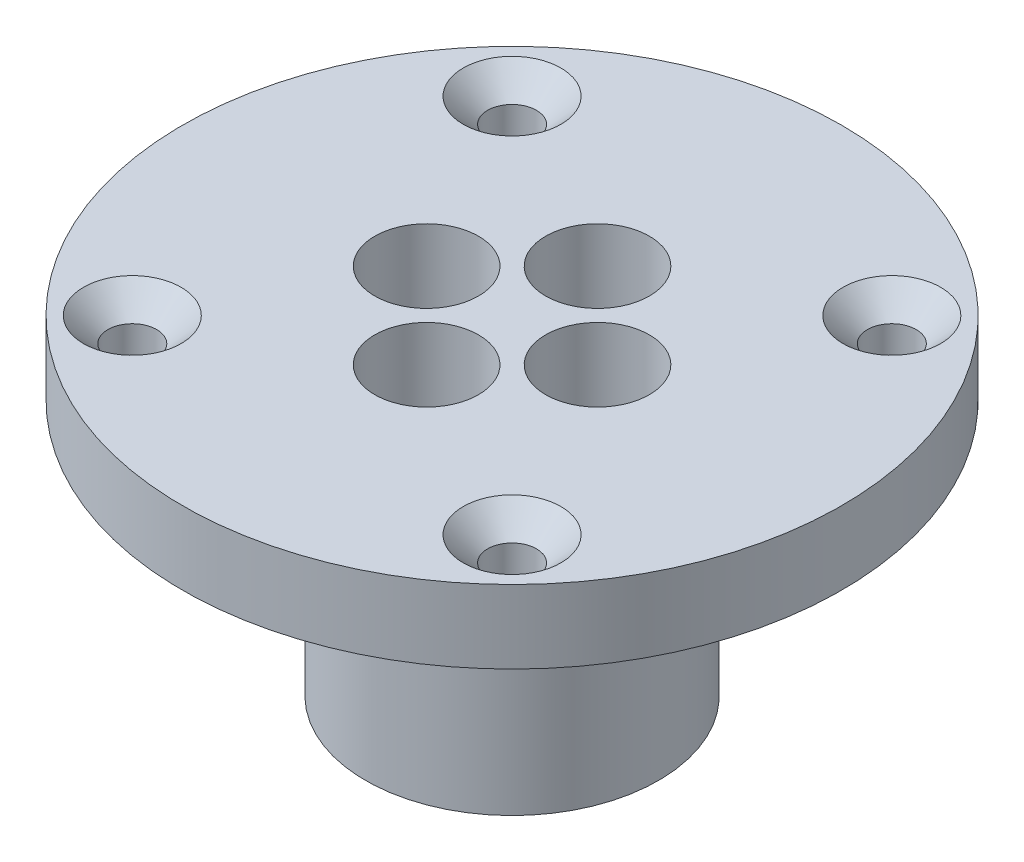
ISO-10303-21;
HEADER;
FILE_DESCRIPTION(('STEP AP214'),'2;1');
FILE_NAME('part.step','',(''),(''),'','','');
FILE_SCHEMA(('AUTOMOTIVE_DESIGN { 1 0 10303 214 1 1 1 1 }'));
ENDSEC;
DATA;
#1=APPLICATION_CONTEXT('core data for automotive mechanical design processes');
#2=APPLICATION_PROTOCOL_DEFINITION('international standard','automotive_design',2000,#1);
#3=PRODUCT_CONTEXT('',#1,'mechanical');
#4=PRODUCT('Part','Part','',(#3));
#5=PRODUCT_RELATED_PRODUCT_CATEGORY('part','',(#4));
#6=PRODUCT_DEFINITION_FORMATION('','',#4);
#7=PRODUCT_DEFINITION_CONTEXT('part definition',#1,'design');
#8=PRODUCT_DEFINITION('design','',#6,#7);
#9=PRODUCT_DEFINITION_SHAPE('','',#8);
#10=(LENGTH_UNIT() NAMED_UNIT(*) SI_UNIT(.MILLI.,.METRE.));
#11=(NAMED_UNIT(*) PLANE_ANGLE_UNIT() SI_UNIT($,.RADIAN.));
#12=(NAMED_UNIT(*) SI_UNIT($,.STERADIAN.) SOLID_ANGLE_UNIT());
#13=UNCERTAINTY_MEASURE_WITH_UNIT(LENGTH_MEASURE(1.E-05),#10,'distance_accuracy_value','');
#14=(GEOMETRIC_REPRESENTATION_CONTEXT(3) GLOBAL_UNCERTAINTY_ASSIGNED_CONTEXT((#13)) GLOBAL_UNIT_ASSIGNED_CONTEXT((#10,
#11,#12)) REPRESENTATION_CONTEXT('',''));
#15=CARTESIAN_POINT('',(0.,0.,0.));
#16=DIRECTION('',(0.,0.,1.));
#17=DIRECTION('',(1.,0.,0.));
#18=AXIS2_PLACEMENT_3D('',#15,#16,#17);
#19=CARTESIAN_POINT('',(0.,25.,0.));
#20=DIRECTION('',(0.,1.,0.));
#21=DIRECTION('',(0.,0.,1.));
#22=AXIS2_PLACEMENT_3D('',#19,#20,#21);
#23=PLANE('',#22);
#24=CARTESIAN_POINT('',(15.5563491861041,25.,-15.556349186104));
#25=DIRECTION('',(0.,1.,0.));
#26=DIRECTION('',(0.,0.,1.));
#27=AXIS2_PLACEMENT_3D('',#24,#25,#26);
#28=CIRCLE('',#27,4.00000000000001);
#29=CARTESIAN_POINT('',(15.5563491861041,25.,-11.556349186104));
#30=VERTEX_POINT('',#29);
#31=EDGE_CURVE('E62',#30,#30,#28,.F.);
#32=ORIENTED_EDGE('',*,*,#31,.T.);
#33=EDGE_LOOP('',(#32));
#34=FACE_BOUND('',#33,.T.);
#35=CARTESIAN_POINT('',(-15.5563491861041,25.,-15.556349186104));
#36=DIRECTION('',(0.,1.,0.));
#37=DIRECTION('',(0.,0.,1.));
#38=AXIS2_PLACEMENT_3D('',#35,#36,#37);
#39=CIRCLE('',#38,4.00000000000001);
#40=CARTESIAN_POINT('',(-15.5563491861041,25.,-11.556349186104));
#41=VERTEX_POINT('',#40);
#42=EDGE_CURVE('E68',#41,#41,#39,.F.);
#43=ORIENTED_EDGE('',*,*,#42,.T.);
#44=EDGE_LOOP('',(#43));
#45=FACE_BOUND('',#44,.T.);
#46=CARTESIAN_POINT('',(-15.5563491861042,25.,15.5563491861039));
#47=DIRECTION('',(0.,1.,0.));
#48=DIRECTION('',(0.,0.,1.));
#49=AXIS2_PLACEMENT_3D('',#46,#47,#48);
#50=CIRCLE('',#49,4.00000000000001);
#51=CARTESIAN_POINT('',(-15.5563491861042,25.,19.5563491861039));
#52=VERTEX_POINT('',#51);
#53=EDGE_CURVE('E72',#52,#52,#50,.F.);
#54=ORIENTED_EDGE('',*,*,#53,.T.);
#55=EDGE_LOOP('',(#54));
#56=FACE_BOUND('',#55,.T.);
#57=CARTESIAN_POINT('',(15.5563491861041,25.,15.556349186104));
#58=DIRECTION('',(0.,1.,0.));
#59=DIRECTION('',(0.,0.,1.));
#60=AXIS2_PLACEMENT_3D('',#57,#58,#59);
#61=CIRCLE('',#60,4.00000000000001);
#62=CARTESIAN_POINT('',(15.5563491861041,25.,19.556349186104));
#63=VERTEX_POINT('',#62);
#64=EDGE_CURVE('E76',#63,#63,#61,.F.);
#65=ORIENTED_EDGE('',*,*,#64,.T.);
#66=EDGE_LOOP('',(#65));
#67=FACE_BOUND('',#66,.T.);
#68=CARTESIAN_POINT('',(0.,25.,-7.));
#69=DIRECTION('',(0.,-1.,0.));
#70=DIRECTION('',(0.,0.,1.));
#71=AXIS2_PLACEMENT_3D('',#68,#69,#70);
#72=CIRCLE('',#71,4.25);
#73=CARTESIAN_POINT('',(0.,25.,-2.75));
#74=VERTEX_POINT('',#73);
#75=EDGE_CURVE('E159',#74,#74,#72,.T.);
#76=ORIENTED_EDGE('',*,*,#75,.T.);
#77=EDGE_LOOP('',(#76));
#78=FACE_BOUND('',#77,.T.);
#79=CARTESIAN_POINT('',(7.,25.,0.));
#80=DIRECTION('',(0.,-1.,0.));
#81=DIRECTION('',(-1.,0.,0.));
#82=AXIS2_PLACEMENT_3D('',#79,#80,#81);
#83=CIRCLE('',#82,4.25);
#84=CARTESIAN_POINT('',(2.75,25.,0.));
#85=VERTEX_POINT('',#84);
#86=EDGE_CURVE('E167',#85,#85,#83,.T.);
#87=ORIENTED_EDGE('',*,*,#86,.T.);
#88=EDGE_LOOP('',(#87));
#89=FACE_BOUND('',#88,.T.);
#90=CARTESIAN_POINT('',(-7.,25.,0.));
#91=DIRECTION('',(0.,-1.,0.));
#92=DIRECTION('',(1.,0.,0.));
#93=AXIS2_PLACEMENT_3D('',#90,#91,#92);
#94=CIRCLE('',#93,4.25);
#95=CARTESIAN_POINT('',(-2.75,25.,0.));
#96=VERTEX_POINT('',#95);
#97=EDGE_CURVE('E151',#96,#96,#94,.T.);
#98=ORIENTED_EDGE('',*,*,#97,.T.);
#99=EDGE_LOOP('',(#98));
#100=FACE_BOUND('',#99,.T.);
#101=CARTESIAN_POINT('',(0.,25.,7.));
#102=DIRECTION('',(0.,-1.,0.));
#103=DIRECTION('',(0.,0.,-1.));
#104=AXIS2_PLACEMENT_3D('',#101,#102,#103);
#105=CIRCLE('',#104,4.25);
#106=CARTESIAN_POINT('',(0.,25.,2.75));
#107=VERTEX_POINT('',#106);
#108=EDGE_CURVE('E146',#107,#107,#105,.T.);
#109=ORIENTED_EDGE('',*,*,#108,.T.);
#110=EDGE_LOOP('',(#109));
#111=FACE_BOUND('',#110,.T.);
#112=CARTESIAN_POINT('',(0.,25.,0.));
#113=DIRECTION('',(0.,-1.,0.));
#114=DIRECTION('',(0.,0.,-1.));
#115=AXIS2_PLACEMENT_3D('',#112,#113,#114);
#116=CIRCLE('',#115,27.);
#117=CARTESIAN_POINT('',(0.,25.,-27.));
#118=VERTEX_POINT('',#117);
#119=EDGE_CURVE('E134',#118,#118,#116,.T.);
#120=ORIENTED_EDGE('',*,*,#119,.F.);
#121=EDGE_LOOP('',(#120));
#122=FACE_BOUND('',#121,.T.);
#123=ADVANCED_FACE('F43',(#34,#45,#56,#67,#78,#89,#100,#111,#122),#23,.T.);
#124=CARTESIAN_POINT('',(0.,0.,0.));
#125=DIRECTION('',(0.,-1.,0.));
#126=DIRECTION('',(0.,0.,-1.));
#127=AXIS2_PLACEMENT_3D('',#124,#125,#126);
#128=CYLINDRICAL_SURFACE('',#127,27.);
#129=ORIENTED_EDGE('',*,*,#119,.T.);
#130=EDGE_LOOP('',(#129));
#131=FACE_BOUND('',#130,.T.);
#132=CARTESIAN_POINT('',(0.,19.,0.));
#133=DIRECTION('',(0.,-1.,0.));
#134=DIRECTION('',(0.,0.,-1.));
#135=AXIS2_PLACEMENT_3D('',#132,#133,#134);
#136=CIRCLE('',#135,27.);
#137=CARTESIAN_POINT('',(0.,19.,-27.));
#138=VERTEX_POINT('',#137);
#139=EDGE_CURVE('E138',#138,#138,#136,.T.);
#140=ORIENTED_EDGE('',*,*,#139,.F.);
#141=EDGE_LOOP('',(#140));
#142=FACE_BOUND('',#141,.T.);
#143=ADVANCED_FACE('F212',(#131,#142),#128,.T.);
#144=CARTESIAN_POINT('',(27.,19.,0.));
#145=DIRECTION('',(0.,-1.,0.));
#146=DIRECTION('',(0.,0.,-1.));
#147=AXIS2_PLACEMENT_3D('',#144,#145,#146);
#148=PLANE('',#147);
#149=CARTESIAN_POINT('',(15.5563491861041,19.,-15.556349186104));
#150=DIRECTION('',(0.,-1.,0.));
#151=DIRECTION('',(0.,0.,-1.));
#152=AXIS2_PLACEMENT_3D('',#149,#150,#151);
#153=CIRCLE('',#152,2.);
#154=CARTESIAN_POINT('',(15.5563491861041,19.,-17.556349186104));
#155=VERTEX_POINT('',#154);
#156=EDGE_CURVE('E85',#155,#155,#153,.T.);
#157=ORIENTED_EDGE('',*,*,#156,.F.);
#158=EDGE_LOOP('',(#157));
#159=FACE_BOUND('',#158,.T.);
#160=CARTESIAN_POINT('',(15.5563491861041,19.,15.556349186104));
#161=DIRECTION('',(0.,-1.,0.));
#162=DIRECTION('',(0.,0.,-1.));
#163=AXIS2_PLACEMENT_3D('',#160,#161,#162);
#164=CIRCLE('',#163,2.);
#165=CARTESIAN_POINT('',(15.5563491861041,19.,13.556349186104));
#166=VERTEX_POINT('',#165);
#167=EDGE_CURVE('E90',#166,#166,#164,.T.);
#168=ORIENTED_EDGE('',*,*,#167,.F.);
#169=EDGE_LOOP('',(#168));
#170=FACE_BOUND('',#169,.T.);
#171=CARTESIAN_POINT('',(-15.5563491861042,19.,15.5563491861039));
#172=DIRECTION('',(0.,-1.,0.));
#173=DIRECTION('',(0.,0.,-1.));
#174=AXIS2_PLACEMENT_3D('',#171,#172,#173);
#175=CIRCLE('',#174,2.);
#176=CARTESIAN_POINT('',(-15.5563491861042,19.,13.5563491861039));
#177=VERTEX_POINT('',#176);
#178=EDGE_CURVE('E94',#177,#177,#175,.T.);
#179=ORIENTED_EDGE('',*,*,#178,.F.);
#180=EDGE_LOOP('',(#179));
#181=FACE_BOUND('',#180,.T.);
#182=CARTESIAN_POINT('',(-15.5563491861041,19.,-15.556349186104));
#183=DIRECTION('',(0.,-1.,0.));
#184=DIRECTION('',(0.,0.,-1.));
#185=AXIS2_PLACEMENT_3D('',#182,#183,#184);
#186=CIRCLE('',#185,2.);
#187=CARTESIAN_POINT('',(-15.5563491861041,19.,-17.556349186104));
#188=VERTEX_POINT('',#187);
#189=EDGE_CURVE('E89',#188,#188,#186,.T.);
#190=ORIENTED_EDGE('',*,*,#189,.F.);
#191=EDGE_LOOP('',(#190));
#192=FACE_BOUND('',#191,.T.);
#193=ORIENTED_EDGE('',*,*,#139,.T.);
#194=EDGE_LOOP('',(#193));
#195=FACE_BOUND('',#194,.T.);
#196=CARTESIAN_POINT('',(0.,19.,0.));
#197=DIRECTION('',(0.,-1.,0.));
#198=DIRECTION('',(0.,0.,-1.));
#199=AXIS2_PLACEMENT_3D('',#196,#197,#198);
#200=CIRCLE('',#199,12.);
#201=CARTESIAN_POINT('',(0.,19.,-12.));
#202=VERTEX_POINT('',#201);
#203=EDGE_CURVE('E142',#202,#202,#200,.T.);
#204=ORIENTED_EDGE('',*,*,#203,.F.);
#205=EDGE_LOOP('',(#204));
#206=FACE_BOUND('',#205,.T.);
#207=ADVANCED_FACE('F218',(#159,#170,#181,#192,#195,#206),#148,.T.);
#208=CARTESIAN_POINT('',(0.,0.,0.));
#209=DIRECTION('',(0.,-1.,0.));
#210=DIRECTION('',(0.,0.,-1.));
#211=AXIS2_PLACEMENT_3D('',#208,#209,#210);
#212=CYLINDRICAL_SURFACE('',#211,12.);
#213=ORIENTED_EDGE('',*,*,#203,.T.);
#214=EDGE_LOOP('',(#213));
#215=FACE_BOUND('',#214,.T.);
#216=CARTESIAN_POINT('',(0.,-2.,0.));
#217=DIRECTION('',(0.,-1.,0.));
#218=DIRECTION('',(0.,0.,-1.));
#219=AXIS2_PLACEMENT_3D('',#216,#217,#218);
#220=CIRCLE('',#219,12.);
#221=CARTESIAN_POINT('',(0.,-2.,-12.));
#222=VERTEX_POINT('',#221);
#223=EDGE_CURVE('E98',#222,#222,#220,.T.);
#224=ORIENTED_EDGE('',*,*,#223,.F.);
#225=EDGE_LOOP('',(#224));
#226=FACE_BOUND('',#225,.T.);
#227=ADVANCED_FACE('F295',(#215,#226),#212,.T.);
#228=CARTESIAN_POINT('',(0.,6.,7.));
#229=DIRECTION('',(0.,-1.,0.));
#230=DIRECTION('',(0.,0.,-1.));
#231=AXIS2_PLACEMENT_3D('',#228,#229,#230);
#232=CYLINDRICAL_SURFACE('',#231,1.75);
#233=CARTESIAN_POINT('',(0.,4.,7.));
#234=DIRECTION('',(0.,-1.,0.));
#235=DIRECTION('',(0.,0.,-1.));
#236=AXIS2_PLACEMENT_3D('',#233,#234,#235);
#237=CIRCLE('',#236,1.75);
#238=CARTESIAN_POINT('',(0.,4.,5.25));
#239=VERTEX_POINT('',#238);
#240=EDGE_CURVE('E110',#239,#239,#237,.F.);
#241=ORIENTED_EDGE('',*,*,#240,.T.);
#242=EDGE_LOOP('',(#241));
#243=FACE_BOUND('',#242,.T.);
#244=CARTESIAN_POINT('',(0.,-2.,7.));
#245=DIRECTION('',(0.,-1.,0.));
#246=DIRECTION('',(0.,0.,-1.));
#247=AXIS2_PLACEMENT_3D('',#244,#245,#246);
#248=CIRCLE('',#247,1.75);
#249=CARTESIAN_POINT('',(0.,-2.,5.25));
#250=VERTEX_POINT('',#249);
#251=EDGE_CURVE('E192',#250,#250,#248,.T.);
#252=ORIENTED_EDGE('',*,*,#251,.T.);
#253=EDGE_LOOP('',(#252));
#254=FACE_BOUND('',#253,.T.);
#255=ADVANCED_FACE('F197',(#243,#254),#232,.F.);
#256=CARTESIAN_POINT('',(0.,25.,7.));
#257=DIRECTION('',(0.,-1.,0.));
#258=DIRECTION('',(0.,0.,-1.));
#259=AXIS2_PLACEMENT_3D('',#256,#257,#258);
#260=CYLINDRICAL_SURFACE('',#259,4.25);
#261=ORIENTED_EDGE('',*,*,#108,.F.);
#262=EDGE_LOOP('',(#261));
#263=FACE_BOUND('',#262,.T.);
#264=CARTESIAN_POINT('',(0.,6.,7.));
#265=DIRECTION('',(0.,-1.,0.));
#266=DIRECTION('',(0.,0.,-1.));
#267=AXIS2_PLACEMENT_3D('',#264,#265,#266);
#268=CIRCLE('',#267,4.25);
#269=CARTESIAN_POINT('',(0.,6.,2.75));
#270=VERTEX_POINT('',#269);
#271=EDGE_CURVE('E147',#270,#270,#268,.T.);
#272=ORIENTED_EDGE('',*,*,#271,.T.);
#273=EDGE_LOOP('',(#272));
#274=FACE_BOUND('',#273,.T.);
#275=ADVANCED_FACE('F327',(#263,#274),#260,.F.);
#276=CARTESIAN_POINT('',(0.,6.,7.));
#277=DIRECTION('',(0.,-1.,0.));
#278=DIRECTION('',(0.,0.,-1.));
#279=AXIS2_PLACEMENT_3D('',#276,#277,#278);
#280=PLANE('',#279);
#281=CARTESIAN_POINT('',(0.,6.,7.));
#282=DIRECTION('',(0.,-1.,0.));
#283=DIRECTION('',(0.,0.,-1.));
#284=AXIS2_PLACEMENT_3D('',#281,#282,#283);
#285=CIRCLE('',#284,3.75);
#286=CARTESIAN_POINT('',(0.,6.,3.25));
#287=VERTEX_POINT('',#286);
#288=EDGE_CURVE('E114',#287,#287,#285,.T.);
#289=ORIENTED_EDGE('',*,*,#288,.T.);
#290=EDGE_LOOP('',(#289));
#291=FACE_BOUND('',#290,.T.);
#292=ORIENTED_EDGE('',*,*,#271,.F.);
#293=EDGE_LOOP('',(#292));
#294=FACE_BOUND('',#293,.T.);
#295=ADVANCED_FACE('F320',(#291,#294),#280,.F.);
#296=CARTESIAN_POINT('',(7.,6.,0.));
#297=DIRECTION('',(0.,-1.,0.));
#298=DIRECTION('',(0.,0.,-1.));
#299=AXIS2_PLACEMENT_3D('',#296,#297,#298);
#300=CYLINDRICAL_SURFACE('',#299,1.75);
#301=CARTESIAN_POINT('',(7.,4.,0.));
#302=DIRECTION('',(0.,-1.,0.));
#303=DIRECTION('',(0.,0.,-1.));
#304=AXIS2_PLACEMENT_3D('',#301,#302,#303);
#305=CIRCLE('',#304,1.75);
#306=CARTESIAN_POINT('',(7.,4.,-1.74999999999993));
#307=VERTEX_POINT('',#306);
#308=EDGE_CURVE('E84',#307,#307,#305,.F.);
#309=ORIENTED_EDGE('',*,*,#308,.T.);
#310=EDGE_LOOP('',(#309));
#311=FACE_BOUND('',#310,.T.);
#312=CARTESIAN_POINT('',(7.,-2.,0.));
#313=DIRECTION('',(0.,-1.,0.));
#314=DIRECTION('',(0.,0.,-1.));
#315=AXIS2_PLACEMENT_3D('',#312,#313,#314);
#316=CIRCLE('',#315,1.75);
#317=CARTESIAN_POINT('',(7.,-2.,-1.74999999999993));
#318=VERTEX_POINT('',#317);
#319=EDGE_CURVE('E188',#318,#318,#316,.T.);
#320=ORIENTED_EDGE('',*,*,#319,.T.);
#321=EDGE_LOOP('',(#320));
#322=FACE_BOUND('',#321,.T.);
#323=ADVANCED_FACE('F310',(#311,#322),#300,.F.);
#324=CARTESIAN_POINT('',(0.,6.,-7.));
#325=DIRECTION('',(0.,-1.,0.));
#326=DIRECTION('',(0.,0.,-1.));
#327=AXIS2_PLACEMENT_3D('',#324,#325,#326);
#328=CYLINDRICAL_SURFACE('',#327,1.75);
#329=CARTESIAN_POINT('',(0.,4.,-7.));
#330=DIRECTION('',(0.,-1.,0.));
#331=DIRECTION('',(0.,0.,-1.));
#332=AXIS2_PLACEMENT_3D('',#329,#330,#331);
#333=CIRCLE('',#332,1.75);
#334=CARTESIAN_POINT('',(0.,4.,-8.75));
#335=VERTEX_POINT('',#334);
#336=EDGE_CURVE('E126',#335,#335,#333,.F.);
#337=ORIENTED_EDGE('',*,*,#336,.T.);
#338=EDGE_LOOP('',(#337));
#339=FACE_BOUND('',#338,.T.);
#340=CARTESIAN_POINT('',(0.,-2.,-7.));
#341=DIRECTION('',(0.,-1.,0.));
#342=DIRECTION('',(0.,0.,-1.));
#343=AXIS2_PLACEMENT_3D('',#340,#341,#342);
#344=CIRCLE('',#343,1.75);
#345=CARTESIAN_POINT('',(0.,-2.,-8.75));
#346=VERTEX_POINT('',#345);
#347=EDGE_CURVE('E184',#346,#346,#344,.T.);
#348=ORIENTED_EDGE('',*,*,#347,.T.);
#349=EDGE_LOOP('',(#348));
#350=FACE_BOUND('',#349,.T.);
#351=ADVANCED_FACE('F307',(#339,#350),#328,.F.);
#352=CARTESIAN_POINT('',(-7.,6.,0.));
#353=DIRECTION('',(0.,-1.,0.));
#354=DIRECTION('',(0.,0.,-1.));
#355=AXIS2_PLACEMENT_3D('',#352,#353,#354);
#356=CYLINDRICAL_SURFACE('',#355,1.75);
#357=CARTESIAN_POINT('',(-7.,4.,0.));
#358=DIRECTION('',(0.,-1.,0.));
#359=DIRECTION('',(0.,0.,-1.));
#360=AXIS2_PLACEMENT_3D('',#357,#358,#359);
#361=CIRCLE('',#360,1.75);
#362=CARTESIAN_POINT('',(-7.,4.,-1.75000000000002));
#363=VERTEX_POINT('',#362);
#364=EDGE_CURVE('E118',#363,#363,#361,.F.);
#365=ORIENTED_EDGE('',*,*,#364,.T.);
#366=EDGE_LOOP('',(#365));
#367=FACE_BOUND('',#366,.T.);
#368=CARTESIAN_POINT('',(-7.,-2.,0.));
#369=DIRECTION('',(0.,-1.,0.));
#370=DIRECTION('',(0.,0.,-1.));
#371=AXIS2_PLACEMENT_3D('',#368,#369,#370);
#372=CIRCLE('',#371,1.75);
#373=CARTESIAN_POINT('',(-7.,-2.,-1.75000000000002));
#374=VERTEX_POINT('',#373);
#375=EDGE_CURVE('E180',#374,#374,#372,.T.);
#376=ORIENTED_EDGE('',*,*,#375,.T.);
#377=EDGE_LOOP('',(#376));
#378=FACE_BOUND('',#377,.T.);
#379=ADVANCED_FACE('F309',(#367,#378),#356,.F.);
#380=CARTESIAN_POINT('',(-7.,25.,0.));
#381=DIRECTION('',(0.,-1.,0.));
#382=DIRECTION('',(0.,0.,-1.));
#383=AXIS2_PLACEMENT_3D('',#380,#381,#382);
#384=CYLINDRICAL_SURFACE('',#383,4.25);
#385=ORIENTED_EDGE('',*,*,#97,.F.);
#386=EDGE_LOOP('',(#385));
#387=FACE_BOUND('',#386,.T.);
#388=CARTESIAN_POINT('',(-7.,6.,0.));
#389=DIRECTION('',(0.,-1.,0.));
#390=DIRECTION('',(1.,0.,0.));
#391=AXIS2_PLACEMENT_3D('',#388,#389,#390);
#392=CIRCLE('',#391,4.25);
#393=CARTESIAN_POINT('',(-2.75,6.,0.));
#394=VERTEX_POINT('',#393);
#395=EDGE_CURVE('E155',#394,#394,#392,.T.);
#396=ORIENTED_EDGE('',*,*,#395,.T.);
#397=EDGE_LOOP('',(#396));
#398=FACE_BOUND('',#397,.T.);
#399=ADVANCED_FACE('F317',(#387,#398),#384,.F.);
#400=CARTESIAN_POINT('',(-7.,6.,0.));
#401=DIRECTION('',(0.,-1.,0.));
#402=DIRECTION('',(1.,0.,0.));
#403=AXIS2_PLACEMENT_3D('',#400,#401,#402);
#404=PLANE('',#403);
#405=CARTESIAN_POINT('',(-7.,6.,0.));
#406=DIRECTION('',(0.,-1.,0.));
#407=DIRECTION('',(0.,0.,-1.));
#408=AXIS2_PLACEMENT_3D('',#405,#406,#407);
#409=CIRCLE('',#408,3.75);
#410=CARTESIAN_POINT('',(-7.,6.,-3.75000000000003));
#411=VERTEX_POINT('',#410);
#412=EDGE_CURVE('E122',#411,#411,#409,.T.);
#413=ORIENTED_EDGE('',*,*,#412,.T.);
#414=EDGE_LOOP('',(#413));
#415=FACE_BOUND('',#414,.T.);
#416=ORIENTED_EDGE('',*,*,#395,.F.);
#417=EDGE_LOOP('',(#416));
#418=FACE_BOUND('',#417,.T.);
#419=ADVANCED_FACE('F501',(#415,#418),#404,.F.);
#420=CARTESIAN_POINT('',(7.,25.,0.));
#421=DIRECTION('',(0.,-1.,0.));
#422=DIRECTION('',(0.,0.,-1.));
#423=AXIS2_PLACEMENT_3D('',#420,#421,#422);
#424=CYLINDRICAL_SURFACE('',#423,4.25);
#425=ORIENTED_EDGE('',*,*,#86,.F.);
#426=EDGE_LOOP('',(#425));
#427=FACE_BOUND('',#426,.T.);
#428=CARTESIAN_POINT('',(7.,6.,0.));
#429=DIRECTION('',(0.,-1.,0.));
#430=DIRECTION('',(-1.,0.,0.));
#431=AXIS2_PLACEMENT_3D('',#428,#429,#430);
#432=CIRCLE('',#431,4.25);
#433=CARTESIAN_POINT('',(2.75,6.,0.));
#434=VERTEX_POINT('',#433);
#435=EDGE_CURVE('E102',#434,#434,#432,.T.);
#436=ORIENTED_EDGE('',*,*,#435,.T.);
#437=EDGE_LOOP('',(#436));
#438=FACE_BOUND('',#437,.T.);
#439=ADVANCED_FACE('F491',(#427,#438),#424,.F.);
#440=CARTESIAN_POINT('',(7.,6.,0.));
#441=DIRECTION('',(0.,-1.,0.));
#442=DIRECTION('',(-1.,0.,0.));
#443=AXIS2_PLACEMENT_3D('',#440,#441,#442);
#444=PLANE('',#443);
#445=CARTESIAN_POINT('',(7.,6.,0.));
#446=DIRECTION('',(0.,-1.,0.));
#447=DIRECTION('',(0.,0.,-1.));
#448=AXIS2_PLACEMENT_3D('',#445,#446,#447);
#449=CIRCLE('',#448,3.75);
#450=CARTESIAN_POINT('',(7.,6.,-3.74999999999993));
#451=VERTEX_POINT('',#450);
#452=EDGE_CURVE('E106',#451,#451,#449,.T.);
#453=ORIENTED_EDGE('',*,*,#452,.T.);
#454=EDGE_LOOP('',(#453));
#455=FACE_BOUND('',#454,.T.);
#456=ORIENTED_EDGE('',*,*,#435,.F.);
#457=EDGE_LOOP('',(#456));
#458=FACE_BOUND('',#457,.T.);
#459=ADVANCED_FACE('F482',(#455,#458),#444,.F.);
#460=CARTESIAN_POINT('',(0.,25.,-7.));
#461=DIRECTION('',(0.,-1.,0.));
#462=DIRECTION('',(0.,0.,-1.));
#463=AXIS2_PLACEMENT_3D('',#460,#461,#462);
#464=CYLINDRICAL_SURFACE('',#463,4.25);
#465=ORIENTED_EDGE('',*,*,#75,.F.);
#466=EDGE_LOOP('',(#465));
#467=FACE_BOUND('',#466,.T.);
#468=CARTESIAN_POINT('',(0.,6.,-7.));
#469=DIRECTION('',(0.,-1.,0.));
#470=DIRECTION('',(0.,0.,1.));
#471=AXIS2_PLACEMENT_3D('',#468,#469,#470);
#472=CIRCLE('',#471,4.25);
#473=CARTESIAN_POINT('',(0.,6.,-2.75));
#474=VERTEX_POINT('',#473);
#475=EDGE_CURVE('E163',#474,#474,#472,.T.);
#476=ORIENTED_EDGE('',*,*,#475,.T.);
#477=EDGE_LOOP('',(#476));
#478=FACE_BOUND('',#477,.T.);
#479=ADVANCED_FACE('F472',(#467,#478),#464,.F.);
#480=CARTESIAN_POINT('',(0.,6.,-7.));
#481=DIRECTION('',(0.,-1.,0.));
#482=DIRECTION('',(0.,0.,1.));
#483=AXIS2_PLACEMENT_3D('',#480,#481,#482);
#484=PLANE('',#483);
#485=CARTESIAN_POINT('',(0.,6.,-7.));
#486=DIRECTION('',(0.,-1.,0.));
#487=DIRECTION('',(0.,0.,-1.));
#488=AXIS2_PLACEMENT_3D('',#485,#486,#487);
#489=CIRCLE('',#488,3.75);
#490=CARTESIAN_POINT('',(0.,6.,-10.75));
#491=VERTEX_POINT('',#490);
#492=EDGE_CURVE('E130',#491,#491,#489,.T.);
#493=ORIENTED_EDGE('',*,*,#492,.T.);
#494=EDGE_LOOP('',(#493));
#495=FACE_BOUND('',#494,.T.);
#496=ORIENTED_EDGE('',*,*,#475,.F.);
#497=EDGE_LOOP('',(#496));
#498=FACE_BOUND('',#497,.T.);
#499=ADVANCED_FACE('F232',(#495,#498),#484,.F.);
#500=CARTESIAN_POINT('',(0.,6.,-7.));
#501=DIRECTION('',(0.,1.,0.));
#502=DIRECTION('',(0.,0.,1.));
#503=AXIS2_PLACEMENT_3D('',#500,#501,#502);
#504=CONICAL_SURFACE('',#503,3.75,0.785398163397448);
#505=ORIENTED_EDGE('',*,*,#336,.F.);
#506=EDGE_LOOP('',(#505));
#507=FACE_BOUND('',#506,.T.);
#508=ORIENTED_EDGE('',*,*,#492,.F.);
#509=EDGE_LOOP('',(#508));
#510=FACE_BOUND('',#509,.T.);
#511=ADVANCED_FACE('F225',(#507,#510),#504,.F.);
#512=CARTESIAN_POINT('',(-7.,6.,0.));
#513=DIRECTION('',(0.,1.,0.));
#514=DIRECTION('',(0.,0.,1.));
#515=AXIS2_PLACEMENT_3D('',#512,#513,#514);
#516=CONICAL_SURFACE('',#515,3.75,0.785398163397448);
#517=ORIENTED_EDGE('',*,*,#364,.F.);
#518=EDGE_LOOP('',(#517));
#519=FACE_BOUND('',#518,.T.);
#520=ORIENTED_EDGE('',*,*,#412,.F.);
#521=EDGE_LOOP('',(#520));
#522=FACE_BOUND('',#521,.T.);
#523=ADVANCED_FACE('F231',(#519,#522),#516,.F.);
#524=CARTESIAN_POINT('',(0.,6.,7.));
#525=DIRECTION('',(0.,1.,0.));
#526=DIRECTION('',(0.,0.,1.));
#527=AXIS2_PLACEMENT_3D('',#524,#525,#526);
#528=CONICAL_SURFACE('',#527,3.75,0.785398163397448);
#529=ORIENTED_EDGE('',*,*,#240,.F.);
#530=EDGE_LOOP('',(#529));
#531=FACE_BOUND('',#530,.T.);
#532=ORIENTED_EDGE('',*,*,#288,.F.);
#533=EDGE_LOOP('',(#532));
#534=FACE_BOUND('',#533,.T.);
#535=ADVANCED_FACE('F239',(#531,#534),#528,.F.);
#536=CARTESIAN_POINT('',(7.,6.,0.));
#537=DIRECTION('',(0.,1.,0.));
#538=DIRECTION('',(0.,0.,1.));
#539=AXIS2_PLACEMENT_3D('',#536,#537,#538);
#540=CONICAL_SURFACE('',#539,3.75,0.785398163397448);
#541=ORIENTED_EDGE('',*,*,#308,.F.);
#542=EDGE_LOOP('',(#541));
#543=FACE_BOUND('',#542,.T.);
#544=ORIENTED_EDGE('',*,*,#452,.F.);
#545=EDGE_LOOP('',(#544));
#546=FACE_BOUND('',#545,.T.);
#547=ADVANCED_FACE('F246',(#543,#546),#540,.F.);
#548=CARTESIAN_POINT('',(-15.5563491861041,0.,-15.556349186104));
#549=DIRECTION('',(0.,1.,0.));
#550=DIRECTION('',(0.,0.,1.));
#551=AXIS2_PLACEMENT_3D('',#548,#549,#550);
#552=CYLINDRICAL_SURFACE('',#551,2.);
#553=CARTESIAN_POINT('',(-15.5563491861041,23.,-15.556349186104));
#554=DIRECTION('',(0.,1.,0.));
#555=DIRECTION('',(0.,0.,1.));
#556=AXIS2_PLACEMENT_3D('',#553,#554,#555);
#557=CIRCLE('',#556,2.);
#558=CARTESIAN_POINT('',(-15.5563491861041,23.,-13.556349186104));
#559=VERTEX_POINT('',#558);
#560=EDGE_CURVE('E57',#559,#559,#557,.T.);
#561=ORIENTED_EDGE('',*,*,#560,.T.);
#562=EDGE_LOOP('',(#561));
#563=FACE_BOUND('',#562,.T.);
#564=ORIENTED_EDGE('',*,*,#189,.T.);
#565=EDGE_LOOP('',(#564));
#566=FACE_BOUND('',#565,.T.);
#567=ADVANCED_FACE('F253',(#563,#566),#552,.F.);
#568=CARTESIAN_POINT('',(-15.5563491861042,0.,15.5563491861039));
#569=DIRECTION('',(0.,1.,0.));
#570=DIRECTION('',(0.,0.,1.));
#571=AXIS2_PLACEMENT_3D('',#568,#569,#570);
#572=CYLINDRICAL_SURFACE('',#571,2.);
#573=CARTESIAN_POINT('',(-15.5563491861042,23.,15.5563491861039));
#574=DIRECTION('',(0.,1.,0.));
#575=DIRECTION('',(0.,0.,1.));
#576=AXIS2_PLACEMENT_3D('',#573,#574,#575);
#577=CIRCLE('',#576,2.);
#578=CARTESIAN_POINT('',(-15.5563491861042,23.,17.5563491861039));
#579=VERTEX_POINT('',#578);
#580=EDGE_CURVE('E52',#579,#579,#577,.T.);
#581=ORIENTED_EDGE('',*,*,#580,.T.);
#582=EDGE_LOOP('',(#581));
#583=FACE_BOUND('',#582,.T.);
#584=ORIENTED_EDGE('',*,*,#178,.T.);
#585=EDGE_LOOP('',(#584));
#586=FACE_BOUND('',#585,.T.);
#587=ADVANCED_FACE('F422',(#583,#586),#572,.F.);
#588=CARTESIAN_POINT('',(15.5563491861041,0.,15.556349186104));
#589=DIRECTION('',(0.,1.,0.));
#590=DIRECTION('',(0.,0.,1.));
#591=AXIS2_PLACEMENT_3D('',#588,#589,#590);
#592=CYLINDRICAL_SURFACE('',#591,2.);
#593=CARTESIAN_POINT('',(15.5563491861041,23.,15.556349186104));
#594=DIRECTION('',(0.,1.,0.));
#595=DIRECTION('',(0.,0.,1.));
#596=AXIS2_PLACEMENT_3D('',#593,#594,#595);
#597=CIRCLE('',#596,2.);
#598=CARTESIAN_POINT('',(15.5563491861041,23.,17.556349186104));
#599=VERTEX_POINT('',#598);
#600=EDGE_CURVE('E10',#599,#599,#597,.T.);
#601=ORIENTED_EDGE('',*,*,#600,.T.);
#602=EDGE_LOOP('',(#601));
#603=FACE_BOUND('',#602,.T.);
#604=ORIENTED_EDGE('',*,*,#167,.T.);
#605=EDGE_LOOP('',(#604));
#606=FACE_BOUND('',#605,.T.);
#607=ADVANCED_FACE('F413',(#603,#606),#592,.F.);
#608=CARTESIAN_POINT('',(15.5563491861041,0.,-15.556349186104));
#609=DIRECTION('',(0.,1.,0.));
#610=DIRECTION('',(0.,0.,1.));
#611=AXIS2_PLACEMENT_3D('',#608,#609,#610);
#612=CYLINDRICAL_SURFACE('',#611,2.);
#613=CARTESIAN_POINT('',(15.5563491861041,23.,-15.556349186104));
#614=DIRECTION('',(0.,1.,0.));
#615=DIRECTION('',(0.,0.,1.));
#616=AXIS2_PLACEMENT_3D('',#613,#614,#615);
#617=CIRCLE('',#616,2.);
#618=CARTESIAN_POINT('',(15.5563491861041,23.,-13.556349186104));
#619=VERTEX_POINT('',#618);
#620=EDGE_CURVE('E80',#619,#619,#617,.T.);
#621=ORIENTED_EDGE('',*,*,#620,.T.);
#622=EDGE_LOOP('',(#621));
#623=FACE_BOUND('',#622,.T.);
#624=ORIENTED_EDGE('',*,*,#156,.T.);
#625=EDGE_LOOP('',(#624));
#626=FACE_BOUND('',#625,.T.);
#627=ADVANCED_FACE('F262',(#623,#626),#612,.F.);
#628=CARTESIAN_POINT('',(15.5563491861041,23.,-15.556349186104));
#629=DIRECTION('',(0.,1.,0.));
#630=DIRECTION('',(0.,0.,1.));
#631=AXIS2_PLACEMENT_3D('',#628,#629,#630);
#632=CONICAL_SURFACE('',#631,2.,0.78539816339745);
#633=ORIENTED_EDGE('',*,*,#31,.F.);
#634=EDGE_LOOP('',(#633));
#635=FACE_BOUND('',#634,.T.);
#636=ORIENTED_EDGE('',*,*,#620,.F.);
#637=EDGE_LOOP('',(#636));
#638=FACE_BOUND('',#637,.T.);
#639=ADVANCED_FACE('F255',(#635,#638),#632,.F.);
#640=CARTESIAN_POINT('',(-15.5563491861041,23.,-15.556349186104));
#641=DIRECTION('',(0.,1.,0.));
#642=DIRECTION('',(0.,0.,1.));
#643=AXIS2_PLACEMENT_3D('',#640,#641,#642);
#644=CONICAL_SURFACE('',#643,2.,0.78539816339745);
#645=ORIENTED_EDGE('',*,*,#42,.F.);
#646=EDGE_LOOP('',(#645));
#647=FACE_BOUND('',#646,.T.);
#648=ORIENTED_EDGE('',*,*,#560,.F.);
#649=EDGE_LOOP('',(#648));
#650=FACE_BOUND('',#649,.T.);
#651=ADVANCED_FACE('F261',(#647,#650),#644,.F.);
#652=CARTESIAN_POINT('',(-15.5563491861042,23.,15.5563491861039));
#653=DIRECTION('',(0.,1.,0.));
#654=DIRECTION('',(0.,0.,1.));
#655=AXIS2_PLACEMENT_3D('',#652,#653,#654);
#656=CONICAL_SURFACE('',#655,2.,0.78539816339745);
#657=ORIENTED_EDGE('',*,*,#53,.F.);
#658=EDGE_LOOP('',(#657));
#659=FACE_BOUND('',#658,.T.);
#660=ORIENTED_EDGE('',*,*,#580,.F.);
#661=EDGE_LOOP('',(#660));
#662=FACE_BOUND('',#661,.T.);
#663=ADVANCED_FACE('F206',(#659,#662),#656,.F.);
#664=CARTESIAN_POINT('',(15.5563491861041,23.,15.556349186104));
#665=DIRECTION('',(0.,1.,0.));
#666=DIRECTION('',(0.,0.,1.));
#667=AXIS2_PLACEMENT_3D('',#664,#665,#666);
#668=CONICAL_SURFACE('',#667,2.,0.78539816339745);
#669=ORIENTED_EDGE('',*,*,#64,.F.);
#670=EDGE_LOOP('',(#669));
#671=FACE_BOUND('',#670,.T.);
#672=ORIENTED_EDGE('',*,*,#600,.F.);
#673=EDGE_LOOP('',(#672));
#674=FACE_BOUND('',#673,.T.);
#675=ADVANCED_FACE('F46',(#671,#674),#668,.F.);
#676=CARTESIAN_POINT('',(0.,-2.,0.));
#677=DIRECTION('',(0.,-1.,0.));
#678=DIRECTION('',(0.,0.,-1.));
#679=AXIS2_PLACEMENT_3D('',#676,#677,#678);
#680=PLANE('',#679);
#681=ORIENTED_EDGE('',*,*,#319,.F.);
#682=EDGE_LOOP('',(#681));
#683=FACE_BOUND('',#682,.T.);
#684=ORIENTED_EDGE('',*,*,#375,.F.);
#685=EDGE_LOOP('',(#684));
#686=FACE_BOUND('',#685,.T.);
#687=ORIENTED_EDGE('',*,*,#223,.T.);
#688=EDGE_LOOP('',(#687));
#689=FACE_BOUND('',#688,.T.);
#690=ORIENTED_EDGE('',*,*,#347,.F.);
#691=EDGE_LOOP('',(#690));
#692=FACE_BOUND('',#691,.T.);
#693=ORIENTED_EDGE('',*,*,#251,.F.);
#694=EDGE_LOOP('',(#693));
#695=FACE_BOUND('',#694,.T.);
#696=ADVANCED_FACE('F199',(#683,#686,#689,#692,#695),#680,.T.);
#697=CLOSED_SHELL('',(#123,#143,#207,#227,#255,#275,#295,#323,#351,#379,#399,#419,#439,#459,
#479,#499,#511,#523,#535,#547,#567,#587,#607,#627,#639,#651,#663,#675,#696));
#698=MANIFOLD_SOLID_BREP('B2',#697);
#699=ADVANCED_BREP_SHAPE_REPRESENTATION('',(#18,#698),#14);
#700=SHAPE_DEFINITION_REPRESENTATION(#9,#699);
ENDSEC;
END-ISO-10303-21;
